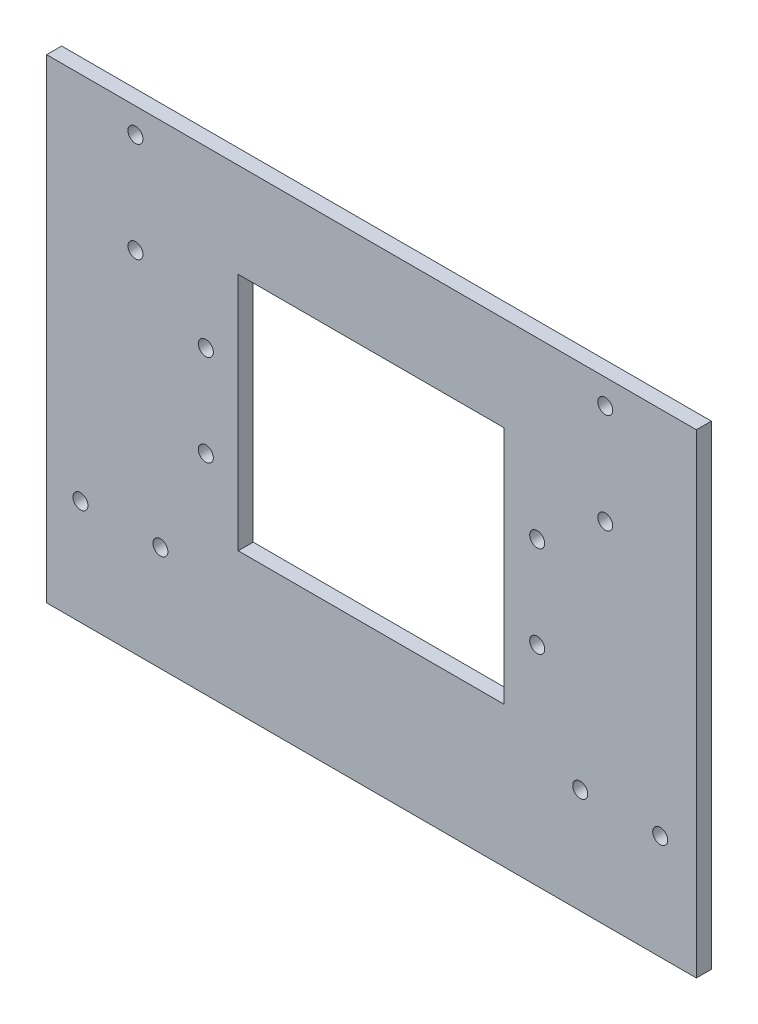
ISO-10303-21;
HEADER;
FILE_DESCRIPTION(('STEP AP214'),'2;1');
FILE_NAME('part.step','',(''),(''),'','','');
FILE_SCHEMA(('AUTOMOTIVE_DESIGN { 1 0 10303 214 1 1 1 1 }'));
ENDSEC;
DATA;
#1=APPLICATION_CONTEXT('core data for automotive mechanical design processes');
#2=APPLICATION_PROTOCOL_DEFINITION('international standard','automotive_design',2000,#1);
#3=PRODUCT_CONTEXT('',#1,'mechanical');
#4=PRODUCT('Part','Part','',(#3));
#5=PRODUCT_RELATED_PRODUCT_CATEGORY('part','',(#4));
#6=PRODUCT_DEFINITION_FORMATION('','',#4);
#7=PRODUCT_DEFINITION_CONTEXT('part definition',#1,'design');
#8=PRODUCT_DEFINITION('design','',#6,#7);
#9=PRODUCT_DEFINITION_SHAPE('','',#8);
#10=(LENGTH_UNIT() NAMED_UNIT(*) SI_UNIT(.MILLI.,.METRE.));
#11=(NAMED_UNIT(*) PLANE_ANGLE_UNIT() SI_UNIT($,.RADIAN.));
#12=(NAMED_UNIT(*) SI_UNIT($,.STERADIAN.) SOLID_ANGLE_UNIT());
#13=UNCERTAINTY_MEASURE_WITH_UNIT(LENGTH_MEASURE(1.E-05),#10,'distance_accuracy_value','');
#14=(GEOMETRIC_REPRESENTATION_CONTEXT(3) GLOBAL_UNCERTAINTY_ASSIGNED_CONTEXT((#13)) GLOBAL_UNIT_ASSIGNED_CONTEXT((#10,
#11,#12)) REPRESENTATION_CONTEXT('',''));
#15=CARTESIAN_POINT('',(0.,0.,0.));
#16=DIRECTION('',(0.,0.,1.));
#17=DIRECTION('',(1.,0.,0.));
#18=AXIS2_PLACEMENT_3D('',#15,#16,#17);
#19=CARTESIAN_POINT('',(-65.,-47.5,3.));
#20=DIRECTION('',(1.,0.,0.));
#21=DIRECTION('',(0.,0.,-1.));
#22=AXIS2_PLACEMENT_3D('',#19,#20,#21);
#23=PLANE('',#22);
#24=DIRECTION('',(0.,-1.,0.));
#25=VECTOR('',#24,1.);
#26=CARTESIAN_POINT('',(-65.,-47.5,0.));
#27=LINE('',#26,#25);
#28=CARTESIAN_POINT('',(-65.,47.5,0.));
#29=VERTEX_POINT('',#28);
#30=CARTESIAN_POINT('',(-65.,-47.5,0.));
#31=VERTEX_POINT('',#30);
#32=EDGE_CURVE('E211',#29,#31,#27,.T.);
#33=ORIENTED_EDGE('',*,*,#32,.T.);
#34=DIRECTION('',(0.,0.,-1.));
#35=VECTOR('',#34,1.);
#36=CARTESIAN_POINT('',(-65.,-47.5,3.));
#37=LINE('',#36,#35);
#38=CARTESIAN_POINT('',(-65.,-47.5,3.));
#39=VERTEX_POINT('',#38);
#40=EDGE_CURVE('E249',#39,#31,#37,.T.);
#41=ORIENTED_EDGE('',*,*,#40,.F.);
#42=DIRECTION('',(0.,-1.,0.));
#43=VECTOR('',#42,1.);
#44=CARTESIAN_POINT('',(-65.,-47.5,3.));
#45=LINE('',#44,#43);
#46=CARTESIAN_POINT('',(-65.,47.5,3.));
#47=VERTEX_POINT('',#46);
#48=EDGE_CURVE('E212',#47,#39,#45,.T.);
#49=ORIENTED_EDGE('',*,*,#48,.F.);
#50=DIRECTION('',(0.,0.,-1.));
#51=VECTOR('',#50,1.);
#52=CARTESIAN_POINT('',(-65.,47.5,3.));
#53=LINE('',#52,#51);
#54=EDGE_CURVE('E226',#47,#29,#53,.T.);
#55=ORIENTED_EDGE('',*,*,#54,.T.);
#56=EDGE_LOOP('',(#33,#41,#49,#55));
#57=FACE_BOUND('',#56,.T.);
#58=ADVANCED_FACE('F44',(#57),#23,.F.);
#59=CARTESIAN_POINT('',(65.,-47.5,3.));
#60=DIRECTION('',(0.,1.,0.));
#61=DIRECTION('',(-1.,0.,0.));
#62=AXIS2_PLACEMENT_3D('',#59,#60,#61);
#63=PLANE('',#62);
#64=DIRECTION('',(1.,0.,0.));
#65=VECTOR('',#64,1.);
#66=CARTESIAN_POINT('',(65.,-47.5,0.));
#67=LINE('',#66,#65);
#68=CARTESIAN_POINT('',(65.,-47.5,0.));
#69=VERTEX_POINT('',#68);
#70=EDGE_CURVE('E230',#31,#69,#67,.T.);
#71=ORIENTED_EDGE('',*,*,#70,.T.);
#72=DIRECTION('',(0.,0.,-1.));
#73=VECTOR('',#72,1.);
#74=CARTESIAN_POINT('',(65.,-47.5,3.));
#75=LINE('',#74,#73);
#76=CARTESIAN_POINT('',(65.,-47.5,3.));
#77=VERTEX_POINT('',#76);
#78=EDGE_CURVE('E245',#77,#69,#75,.T.);
#79=ORIENTED_EDGE('',*,*,#78,.F.);
#80=DIRECTION('',(1.,0.,0.));
#81=VECTOR('',#80,1.);
#82=CARTESIAN_POINT('',(65.,-47.5,3.));
#83=LINE('',#82,#81);
#84=EDGE_CURVE('E216',#39,#77,#83,.T.);
#85=ORIENTED_EDGE('',*,*,#84,.F.);
#86=ORIENTED_EDGE('',*,*,#40,.T.);
#87=EDGE_LOOP('',(#71,#79,#85,#86));
#88=FACE_BOUND('',#87,.T.);
#89=ADVANCED_FACE('F292',(#88),#63,.F.);
#90=CARTESIAN_POINT('',(65.,-47.5,3.));
#91=DIRECTION('',(-1.,0.,0.));
#92=DIRECTION('',(0.,0.,1.));
#93=AXIS2_PLACEMENT_3D('',#90,#91,#92);
#94=PLANE('',#93);
#95=DIRECTION('',(0.,1.,0.));
#96=VECTOR('',#95,1.);
#97=CARTESIAN_POINT('',(65.,-47.5,0.));
#98=LINE('',#97,#96);
#99=CARTESIAN_POINT('',(65.,47.5,0.));
#100=VERTEX_POINT('',#99);
#101=EDGE_CURVE('E233',#69,#100,#98,.T.);
#102=ORIENTED_EDGE('',*,*,#101,.T.);
#103=DIRECTION('',(0.,0.,-1.));
#104=VECTOR('',#103,1.);
#105=CARTESIAN_POINT('',(65.,47.5,3.));
#106=LINE('',#105,#104);
#107=CARTESIAN_POINT('',(65.,47.5,3.));
#108=VERTEX_POINT('',#107);
#109=EDGE_CURVE('E241',#108,#100,#106,.T.);
#110=ORIENTED_EDGE('',*,*,#109,.F.);
#111=DIRECTION('',(0.,1.,0.));
#112=VECTOR('',#111,1.);
#113=CARTESIAN_POINT('',(65.,-47.5,3.));
#114=LINE('',#113,#112);
#115=EDGE_CURVE('E220',#77,#108,#114,.T.);
#116=ORIENTED_EDGE('',*,*,#115,.F.);
#117=ORIENTED_EDGE('',*,*,#78,.T.);
#118=EDGE_LOOP('',(#102,#110,#116,#117));
#119=FACE_BOUND('',#118,.T.);
#120=ADVANCED_FACE('F297',(#119),#94,.F.);
#121=CARTESIAN_POINT('',(65.,47.5,3.));
#122=DIRECTION('',(0.,-1.,0.));
#123=DIRECTION('',(1.,0.,0.));
#124=AXIS2_PLACEMENT_3D('',#121,#122,#123);
#125=PLANE('',#124);
#126=DIRECTION('',(-1.,0.,0.));
#127=VECTOR('',#126,1.);
#128=CARTESIAN_POINT('',(65.,47.5,0.));
#129=LINE('',#128,#127);
#130=EDGE_CURVE('E217',#100,#29,#129,.T.);
#131=ORIENTED_EDGE('',*,*,#130,.T.);
#132=ORIENTED_EDGE('',*,*,#54,.F.);
#133=DIRECTION('',(-1.,0.,0.));
#134=VECTOR('',#133,1.);
#135=CARTESIAN_POINT('',(65.,47.5,3.));
#136=LINE('',#135,#134);
#137=EDGE_CURVE('E223',#108,#47,#136,.T.);
#138=ORIENTED_EDGE('',*,*,#137,.F.);
#139=ORIENTED_EDGE('',*,*,#109,.T.);
#140=EDGE_LOOP('',(#131,#132,#138,#139));
#141=FACE_BOUND('',#140,.T.);
#142=ADVANCED_FACE('F312',(#141),#125,.F.);
#143=CARTESIAN_POINT('',(0.,0.,3.));
#144=DIRECTION('',(0.,0.,1.));
#145=DIRECTION('',(1.,0.,0.));
#146=AXIS2_PLACEMENT_3D('',#143,#144,#145);
#147=PLANE('',#146);
#148=CARTESIAN_POINT('',(33.15,-5.69741209793691,3.));
#149=DIRECTION('',(0.,0.,1.));
#150=DIRECTION('',(1.,0.,0.));
#151=AXIS2_PLACEMENT_3D('',#148,#149,#150);
#152=CIRCLE('',#151,1.5);
#153=CARTESIAN_POINT('',(34.65,-5.69741209793691,3.));
#154=VERTEX_POINT('',#153);
#155=EDGE_CURVE('E403',#154,#154,#152,.T.);
#156=ORIENTED_EDGE('',*,*,#155,.F.);
#157=EDGE_LOOP('',(#156));
#158=FACE_BOUND('',#157,.T.);
#159=CARTESIAN_POINT('',(33.15,12.6025879020631,3.));
#160=DIRECTION('',(0.,0.,1.));
#161=DIRECTION('',(1.,0.,0.));
#162=AXIS2_PLACEMENT_3D('',#159,#160,#161);
#163=CIRCLE('',#162,1.5);
#164=CARTESIAN_POINT('',(34.65,12.6025879020631,3.));
#165=VERTEX_POINT('',#164);
#166=EDGE_CURVE('E406',#165,#165,#163,.T.);
#167=ORIENTED_EDGE('',*,*,#166,.F.);
#168=EDGE_LOOP('',(#167));
#169=FACE_BOUND('',#168,.T.);
#170=CARTESIAN_POINT('',(-33.15,-5.69741209793692,3.));
#171=DIRECTION('',(0.,0.,1.));
#172=DIRECTION('',(1.,0.,0.));
#173=AXIS2_PLACEMENT_3D('',#170,#171,#172);
#174=CIRCLE('',#173,1.5);
#175=CARTESIAN_POINT('',(-31.65,-5.69741209793692,3.));
#176=VERTEX_POINT('',#175);
#177=EDGE_CURVE('E400',#176,#176,#174,.T.);
#178=ORIENTED_EDGE('',*,*,#177,.F.);
#179=EDGE_LOOP('',(#178));
#180=FACE_BOUND('',#179,.T.);
#181=CARTESIAN_POINT('',(-33.15,12.6025879020631,3.));
#182=DIRECTION('',(0.,0.,1.));
#183=DIRECTION('',(1.,0.,0.));
#184=AXIS2_PLACEMENT_3D('',#181,#182,#183);
#185=CIRCLE('',#184,1.5);
#186=CARTESIAN_POINT('',(-31.65,12.6025879020631,3.));
#187=VERTEX_POINT('',#186);
#188=EDGE_CURVE('E397',#187,#187,#185,.T.);
#189=ORIENTED_EDGE('',*,*,#188,.F.);
#190=EDGE_LOOP('',(#189));
#191=FACE_BOUND('',#190,.T.);
#192=DIRECTION('',(0.,-1.,0.));
#193=VECTOR('',#192,1.);
#194=CARTESIAN_POINT('',(-26.6718393666352,-19.3053115784174,3.));
#195=LINE('',#194,#193);
#196=CARTESIAN_POINT('',(-26.6718393666352,28.6025879020631,3.));
#197=VERTEX_POINT('',#196);
#198=CARTESIAN_POINT('',(-26.6718393666352,-19.3053115784174,3.));
#199=VERTEX_POINT('',#198);
#200=EDGE_CURVE('E61',#197,#199,#195,.T.);
#201=ORIENTED_EDGE('',*,*,#200,.F.);
#202=DIRECTION('',(-1.,0.,0.));
#203=VECTOR('',#202,1.);
#204=CARTESIAN_POINT('',(-26.6718393666352,28.6025879020631,3.));
#205=LINE('',#204,#203);
#206=CARTESIAN_POINT('',(26.4781370833923,28.6025879020631,3.));
#207=VERTEX_POINT('',#206);
#208=EDGE_CURVE('E132',#207,#197,#205,.T.);
#209=ORIENTED_EDGE('',*,*,#208,.F.);
#210=DIRECTION('',(0.,1.,0.));
#211=VECTOR('',#210,1.);
#212=CARTESIAN_POINT('',(26.4781370833923,-19.3053115784174,3.));
#213=LINE('',#212,#211);
#214=CARTESIAN_POINT('',(26.4781370833923,-19.3053115784174,3.));
#215=VERTEX_POINT('',#214);
#216=EDGE_CURVE('E114',#215,#207,#213,.T.);
#217=ORIENTED_EDGE('',*,*,#216,.F.);
#218=DIRECTION('',(1.,0.,0.));
#219=VECTOR('',#218,1.);
#220=CARTESIAN_POINT('',(-26.6718393666352,-19.3053115784174,3.));
#221=LINE('',#220,#219);
#222=EDGE_CURVE('E124',#199,#215,#221,.T.);
#223=ORIENTED_EDGE('',*,*,#222,.F.);
#224=EDGE_LOOP('',(#201,#209,#217,#223));
#225=FACE_BOUND('',#224,.T.);
#226=CARTESIAN_POINT('',(46.7671126155352,22.5,3.));
#227=DIRECTION('',(0.,0.,1.));
#228=DIRECTION('',(1.,0.,0.));
#229=AXIS2_PLACEMENT_3D('',#226,#227,#228);
#230=CIRCLE('',#229,1.5);
#231=CARTESIAN_POINT('',(48.2671126155352,22.5,3.));
#232=VERTEX_POINT('',#231);
#233=EDGE_CURVE('E175',#232,#232,#230,.T.);
#234=ORIENTED_EDGE('',*,*,#233,.F.);
#235=EDGE_LOOP('',(#234));
#236=FACE_BOUND('',#235,.T.);
#237=CARTESIAN_POINT('',(-47.2328873844649,42.5,3.));
#238=DIRECTION('',(0.,0.,1.));
#239=DIRECTION('',(1.,0.,0.));
#240=AXIS2_PLACEMENT_3D('',#237,#238,#239);
#241=CIRCLE('',#240,1.5);
#242=CARTESIAN_POINT('',(-45.7328873844649,42.5,3.));
#243=VERTEX_POINT('',#242);
#244=EDGE_CURVE('E171',#243,#243,#241,.T.);
#245=ORIENTED_EDGE('',*,*,#244,.F.);
#246=EDGE_LOOP('',(#245));
#247=FACE_BOUND('',#246,.T.);
#248=CARTESIAN_POINT('',(-47.2328873844649,22.5,3.));
#249=DIRECTION('',(0.,0.,1.));
#250=DIRECTION('',(1.,0.,0.));
#251=AXIS2_PLACEMENT_3D('',#248,#249,#250);
#252=CIRCLE('',#251,1.5);
#253=CARTESIAN_POINT('',(-45.7328873844649,22.5,3.));
#254=VERTEX_POINT('',#253);
#255=EDGE_CURVE('E167',#254,#254,#252,.T.);
#256=ORIENTED_EDGE('',*,*,#255,.F.);
#257=EDGE_LOOP('',(#256));
#258=FACE_BOUND('',#257,.T.);
#259=CARTESIAN_POINT('',(46.7671126155352,42.5,3.));
#260=DIRECTION('',(0.,0.,1.));
#261=DIRECTION('',(1.,0.,0.));
#262=AXIS2_PLACEMENT_3D('',#259,#260,#261);
#263=CIRCLE('',#262,1.5);
#264=CARTESIAN_POINT('',(48.2671126155352,42.5,3.));
#265=VERTEX_POINT('',#264);
#266=EDGE_CURVE('E163',#265,#265,#263,.T.);
#267=ORIENTED_EDGE('',*,*,#266,.F.);
#268=EDGE_LOOP('',(#267));
#269=FACE_BOUND('',#268,.T.);
#270=CARTESIAN_POINT('',(57.7671126155351,-26.5,3.));
#271=DIRECTION('',(0.,0.,1.));
#272=DIRECTION('',(1.,0.,0.));
#273=AXIS2_PLACEMENT_3D('',#270,#271,#272);
#274=CIRCLE('',#273,1.5);
#275=CARTESIAN_POINT('',(59.2671126155351,-26.5,3.));
#276=VERTEX_POINT('',#275);
#277=EDGE_CURVE('E207',#276,#276,#274,.T.);
#278=ORIENTED_EDGE('',*,*,#277,.F.);
#279=EDGE_LOOP('',(#278));
#280=FACE_BOUND('',#279,.T.);
#281=CARTESIAN_POINT('',(41.7671126155351,-26.5,3.));
#282=DIRECTION('',(0.,0.,1.));
#283=DIRECTION('',(1.,0.,0.));
#284=AXIS2_PLACEMENT_3D('',#281,#282,#283);
#285=CIRCLE('',#284,1.5);
#286=CARTESIAN_POINT('',(43.2671126155351,-26.5,3.));
#287=VERTEX_POINT('',#286);
#288=EDGE_CURVE('E203',#287,#287,#285,.T.);
#289=ORIENTED_EDGE('',*,*,#288,.F.);
#290=EDGE_LOOP('',(#289));
#291=FACE_BOUND('',#290,.T.);
#292=CARTESIAN_POINT('',(-42.2328873844649,-26.5,3.));
#293=DIRECTION('',(0.,0.,1.));
#294=DIRECTION('',(1.,0.,0.));
#295=AXIS2_PLACEMENT_3D('',#292,#293,#294);
#296=CIRCLE('',#295,1.5);
#297=CARTESIAN_POINT('',(-40.7328873844649,-26.5,3.));
#298=VERTEX_POINT('',#297);
#299=EDGE_CURVE('E199',#298,#298,#296,.T.);
#300=ORIENTED_EDGE('',*,*,#299,.F.);
#301=EDGE_LOOP('',(#300));
#302=FACE_BOUND('',#301,.T.);
#303=CARTESIAN_POINT('',(-58.2328873844649,-26.5,3.));
#304=DIRECTION('',(0.,0.,1.));
#305=DIRECTION('',(1.,0.,0.));
#306=AXIS2_PLACEMENT_3D('',#303,#304,#305);
#307=CIRCLE('',#306,1.5);
#308=CARTESIAN_POINT('',(-56.7328873844649,-26.5,3.));
#309=VERTEX_POINT('',#308);
#310=EDGE_CURVE('E184',#309,#309,#307,.T.);
#311=ORIENTED_EDGE('',*,*,#310,.F.);
#312=EDGE_LOOP('',(#311));
#313=FACE_BOUND('',#312,.T.);
#314=ORIENTED_EDGE('',*,*,#48,.T.);
#315=ORIENTED_EDGE('',*,*,#84,.T.);
#316=ORIENTED_EDGE('',*,*,#115,.T.);
#317=ORIENTED_EDGE('',*,*,#137,.T.);
#318=EDGE_LOOP('',(#314,#315,#316,#317));
#319=FACE_BOUND('',#318,.T.);
#320=ADVANCED_FACE('F129',(#158,#169,#180,#191,#225,#236,#247,#258,#269,#280,#291,#302,#313,
#319),#147,.T.);
#321=CARTESIAN_POINT('',(0.,0.,0.));
#322=DIRECTION('',(0.,0.,1.));
#323=DIRECTION('',(1.,0.,0.));
#324=AXIS2_PLACEMENT_3D('',#321,#322,#323);
#325=PLANE('',#324);
#326=CARTESIAN_POINT('',(33.15,-5.69741209793691,0.));
#327=DIRECTION('',(0.,0.,1.));
#328=DIRECTION('',(1.,0.,0.));
#329=AXIS2_PLACEMENT_3D('',#326,#327,#328);
#330=CIRCLE('',#329,1.5);
#331=CARTESIAN_POINT('',(34.65,-5.69741209793691,0.));
#332=VERTEX_POINT('',#331);
#333=EDGE_CURVE('E47',#332,#332,#330,.T.);
#334=ORIENTED_EDGE('',*,*,#333,.T.);
#335=EDGE_LOOP('',(#334));
#336=FACE_BOUND('',#335,.T.);
#337=CARTESIAN_POINT('',(33.15,12.6025879020631,0.));
#338=DIRECTION('',(0.,0.,1.));
#339=DIRECTION('',(1.,0.,0.));
#340=AXIS2_PLACEMENT_3D('',#337,#338,#339);
#341=CIRCLE('',#340,1.5);
#342=CARTESIAN_POINT('',(34.65,12.6025879020631,0.));
#343=VERTEX_POINT('',#342);
#344=EDGE_CURVE('E267',#343,#343,#341,.T.);
#345=ORIENTED_EDGE('',*,*,#344,.T.);
#346=EDGE_LOOP('',(#345));
#347=FACE_BOUND('',#346,.T.);
#348=CARTESIAN_POINT('',(-33.15,-5.69741209793692,0.));
#349=DIRECTION('',(0.,0.,1.));
#350=DIRECTION('',(1.,0.,0.));
#351=AXIS2_PLACEMENT_3D('',#348,#349,#350);
#352=CIRCLE('',#351,1.5);
#353=CARTESIAN_POINT('',(-31.65,-5.69741209793692,0.));
#354=VERTEX_POINT('',#353);
#355=EDGE_CURVE('E264',#354,#354,#352,.T.);
#356=ORIENTED_EDGE('',*,*,#355,.T.);
#357=EDGE_LOOP('',(#356));
#358=FACE_BOUND('',#357,.T.);
#359=CARTESIAN_POINT('',(-33.15,12.6025879020631,0.));
#360=DIRECTION('',(0.,0.,1.));
#361=DIRECTION('',(1.,0.,0.));
#362=AXIS2_PLACEMENT_3D('',#359,#360,#361);
#363=CIRCLE('',#362,1.5);
#364=CARTESIAN_POINT('',(-31.65,12.6025879020631,0.));
#365=VERTEX_POINT('',#364);
#366=EDGE_CURVE('E142',#365,#365,#363,.T.);
#367=ORIENTED_EDGE('',*,*,#366,.T.);
#368=EDGE_LOOP('',(#367));
#369=FACE_BOUND('',#368,.T.);
#370=DIRECTION('',(-1.,0.,0.));
#371=VECTOR('',#370,1.);
#372=CARTESIAN_POINT('',(0.,28.6025879020631,0.));
#373=LINE('',#372,#371);
#374=CARTESIAN_POINT('',(26.4781370833923,28.6025879020631,0.));
#375=VERTEX_POINT('',#374);
#376=CARTESIAN_POINT('',(-26.6718393666352,28.6025879020631,0.));
#377=VERTEX_POINT('',#376);
#378=EDGE_CURVE('E53',#375,#377,#373,.T.);
#379=ORIENTED_EDGE('',*,*,#378,.T.);
#380=DIRECTION('',(0.,-1.,0.));
#381=VECTOR('',#380,1.);
#382=CARTESIAN_POINT('',(-26.6718393666352,0.,0.));
#383=LINE('',#382,#381);
#384=CARTESIAN_POINT('',(-26.6718393666352,-19.3053115784174,0.));
#385=VERTEX_POINT('',#384);
#386=EDGE_CURVE('E11',#377,#385,#383,.T.);
#387=ORIENTED_EDGE('',*,*,#386,.T.);
#388=DIRECTION('',(1.,0.,0.));
#389=VECTOR('',#388,1.);
#390=CARTESIAN_POINT('',(0.,-19.3053115784174,0.));
#391=LINE('',#390,#389);
#392=CARTESIAN_POINT('',(26.4781370833923,-19.3053115784174,0.));
#393=VERTEX_POINT('',#392);
#394=EDGE_CURVE('E253',#385,#393,#391,.T.);
#395=ORIENTED_EDGE('',*,*,#394,.T.);
#396=DIRECTION('',(0.,1.,0.));
#397=VECTOR('',#396,1.);
#398=CARTESIAN_POINT('',(26.4781370833923,0.,0.));
#399=LINE('',#398,#397);
#400=EDGE_CURVE('E117',#393,#375,#399,.T.);
#401=ORIENTED_EDGE('',*,*,#400,.T.);
#402=EDGE_LOOP('',(#379,#387,#395,#401));
#403=FACE_BOUND('',#402,.T.);
#404=CARTESIAN_POINT('',(46.7671126155352,22.5,0.));
#405=DIRECTION('',(0.,0.,-1.));
#406=DIRECTION('',(-1.,0.,0.));
#407=AXIS2_PLACEMENT_3D('',#404,#405,#406);
#408=CIRCLE('',#407,1.5);
#409=CARTESIAN_POINT('',(45.2671126155352,22.5,0.));
#410=VERTEX_POINT('',#409);
#411=EDGE_CURVE('E152',#410,#410,#408,.T.);
#412=ORIENTED_EDGE('',*,*,#411,.F.);
#413=EDGE_LOOP('',(#412));
#414=FACE_BOUND('',#413,.T.);
#415=CARTESIAN_POINT('',(-47.2328873844649,42.5,0.));
#416=DIRECTION('',(0.,0.,-1.));
#417=DIRECTION('',(-1.,0.,0.));
#418=AXIS2_PLACEMENT_3D('',#415,#416,#417);
#419=CIRCLE('',#418,1.5);
#420=CARTESIAN_POINT('',(-48.7328873844649,42.5,0.));
#421=VERTEX_POINT('',#420);
#422=EDGE_CURVE('E151',#421,#421,#419,.T.);
#423=ORIENTED_EDGE('',*,*,#422,.F.);
#424=EDGE_LOOP('',(#423));
#425=FACE_BOUND('',#424,.T.);
#426=CARTESIAN_POINT('',(-47.2328873844649,22.5,0.));
#427=DIRECTION('',(0.,0.,-1.));
#428=DIRECTION('',(-1.,0.,0.));
#429=AXIS2_PLACEMENT_3D('',#426,#427,#428);
#430=CIRCLE('',#429,1.5);
#431=CARTESIAN_POINT('',(-48.7328873844649,22.5,0.));
#432=VERTEX_POINT('',#431);
#433=EDGE_CURVE('E147',#432,#432,#430,.T.);
#434=ORIENTED_EDGE('',*,*,#433,.F.);
#435=EDGE_LOOP('',(#434));
#436=FACE_BOUND('',#435,.T.);
#437=CARTESIAN_POINT('',(46.7671126155352,42.5,0.));
#438=DIRECTION('',(0.,0.,-1.));
#439=DIRECTION('',(-1.,0.,0.));
#440=AXIS2_PLACEMENT_3D('',#437,#438,#439);
#441=CIRCLE('',#440,1.5);
#442=CARTESIAN_POINT('',(45.2671126155352,42.5,0.));
#443=VERTEX_POINT('',#442);
#444=EDGE_CURVE('E156',#443,#443,#441,.T.);
#445=ORIENTED_EDGE('',*,*,#444,.F.);
#446=EDGE_LOOP('',(#445));
#447=FACE_BOUND('',#446,.T.);
#448=CARTESIAN_POINT('',(57.7671126155351,-26.5,0.));
#449=DIRECTION('',(0.,0.,-1.));
#450=DIRECTION('',(-1.,0.,0.));
#451=AXIS2_PLACEMENT_3D('',#448,#449,#450);
#452=CIRCLE('',#451,1.5);
#453=CARTESIAN_POINT('',(56.2671126155351,-26.5,0.));
#454=VERTEX_POINT('',#453);
#455=EDGE_CURVE('E180',#454,#454,#452,.T.);
#456=ORIENTED_EDGE('',*,*,#455,.F.);
#457=EDGE_LOOP('',(#456));
#458=FACE_BOUND('',#457,.T.);
#459=CARTESIAN_POINT('',(41.7671126155351,-26.5,0.));
#460=DIRECTION('',(0.,0.,-1.));
#461=DIRECTION('',(-1.,0.,0.));
#462=AXIS2_PLACEMENT_3D('',#459,#460,#461);
#463=CIRCLE('',#462,1.5);
#464=CARTESIAN_POINT('',(40.2671126155351,-26.5,0.));
#465=VERTEX_POINT('',#464);
#466=EDGE_CURVE('E185',#465,#465,#463,.T.);
#467=ORIENTED_EDGE('',*,*,#466,.F.);
#468=EDGE_LOOP('',(#467));
#469=FACE_BOUND('',#468,.T.);
#470=CARTESIAN_POINT('',(-42.2328873844649,-26.5,0.));
#471=DIRECTION('',(0.,0.,-1.));
#472=DIRECTION('',(-1.,0.,0.));
#473=AXIS2_PLACEMENT_3D('',#470,#471,#472);
#474=CIRCLE('',#473,1.5);
#475=CARTESIAN_POINT('',(-43.7328873844649,-26.5,0.));
#476=VERTEX_POINT('',#475);
#477=EDGE_CURVE('E189',#476,#476,#474,.T.);
#478=ORIENTED_EDGE('',*,*,#477,.F.);
#479=EDGE_LOOP('',(#478));
#480=FACE_BOUND('',#479,.T.);
#481=CARTESIAN_POINT('',(-58.2328873844649,-26.5,0.));
#482=DIRECTION('',(0.,0.,-1.));
#483=DIRECTION('',(-1.,0.,0.));
#484=AXIS2_PLACEMENT_3D('',#481,#482,#483);
#485=CIRCLE('',#484,1.5);
#486=CARTESIAN_POINT('',(-59.7328873844649,-26.5,0.));
#487=VERTEX_POINT('',#486);
#488=EDGE_CURVE('E179',#487,#487,#485,.T.);
#489=ORIENTED_EDGE('',*,*,#488,.F.);
#490=EDGE_LOOP('',(#489));
#491=FACE_BOUND('',#490,.T.);
#492=ORIENTED_EDGE('',*,*,#32,.F.);
#493=ORIENTED_EDGE('',*,*,#130,.F.);
#494=ORIENTED_EDGE('',*,*,#101,.F.);
#495=ORIENTED_EDGE('',*,*,#70,.F.);
#496=EDGE_LOOP('',(#492,#493,#494,#495));
#497=FACE_BOUND('',#496,.T.);
#498=ADVANCED_FACE('F276',(#336,#347,#358,#369,#403,#414,#425,#436,#447,#458,#469,#480,#491,
#497),#325,.F.);
#499=CARTESIAN_POINT('',(-58.2328873844649,-26.5,10.));
#500=DIRECTION('',(0.,0.,-1.));
#501=DIRECTION('',(-1.,0.,0.));
#502=AXIS2_PLACEMENT_3D('',#499,#500,#501);
#503=CYLINDRICAL_SURFACE('',#502,1.5);
#504=ORIENTED_EDGE('',*,*,#310,.T.);
#505=EDGE_LOOP('',(#504));
#506=FACE_BOUND('',#505,.T.);
#507=ORIENTED_EDGE('',*,*,#488,.T.);
#508=EDGE_LOOP('',(#507));
#509=FACE_BOUND('',#508,.T.);
#510=ADVANCED_FACE('F323',(#506,#509),#503,.F.);
#511=CARTESIAN_POINT('',(-42.2328873844649,-26.5,10.));
#512=DIRECTION('',(0.,0.,-1.));
#513=DIRECTION('',(-1.,0.,0.));
#514=AXIS2_PLACEMENT_3D('',#511,#512,#513);
#515=CYLINDRICAL_SURFACE('',#514,1.5);
#516=ORIENTED_EDGE('',*,*,#299,.T.);
#517=EDGE_LOOP('',(#516));
#518=FACE_BOUND('',#517,.T.);
#519=ORIENTED_EDGE('',*,*,#477,.T.);
#520=EDGE_LOOP('',(#519));
#521=FACE_BOUND('',#520,.T.);
#522=ADVANCED_FACE('F329',(#518,#521),#515,.F.);
#523=CARTESIAN_POINT('',(41.7671126155351,-26.5,10.));
#524=DIRECTION('',(0.,0.,-1.));
#525=DIRECTION('',(-1.,0.,0.));
#526=AXIS2_PLACEMENT_3D('',#523,#524,#525);
#527=CYLINDRICAL_SURFACE('',#526,1.5);
#528=ORIENTED_EDGE('',*,*,#288,.T.);
#529=EDGE_LOOP('',(#528));
#530=FACE_BOUND('',#529,.T.);
#531=ORIENTED_EDGE('',*,*,#466,.T.);
#532=EDGE_LOOP('',(#531));
#533=FACE_BOUND('',#532,.T.);
#534=ADVANCED_FACE('F333',(#530,#533),#527,.F.);
#535=CARTESIAN_POINT('',(57.7671126155351,-26.5,10.));
#536=DIRECTION('',(0.,0.,-1.));
#537=DIRECTION('',(-1.,0.,0.));
#538=AXIS2_PLACEMENT_3D('',#535,#536,#537);
#539=CYLINDRICAL_SURFACE('',#538,1.5);
#540=ORIENTED_EDGE('',*,*,#277,.T.);
#541=EDGE_LOOP('',(#540));
#542=FACE_BOUND('',#541,.T.);
#543=ORIENTED_EDGE('',*,*,#455,.T.);
#544=EDGE_LOOP('',(#543));
#545=FACE_BOUND('',#544,.T.);
#546=ADVANCED_FACE('F337',(#542,#545),#539,.F.);
#547=CARTESIAN_POINT('',(46.7671126155352,42.5,10.));
#548=DIRECTION('',(0.,0.,-1.));
#549=DIRECTION('',(-1.,0.,0.));
#550=AXIS2_PLACEMENT_3D('',#547,#548,#549);
#551=CYLINDRICAL_SURFACE('',#550,1.5);
#552=ORIENTED_EDGE('',*,*,#266,.T.);
#553=EDGE_LOOP('',(#552));
#554=FACE_BOUND('',#553,.T.);
#555=ORIENTED_EDGE('',*,*,#444,.T.);
#556=EDGE_LOOP('',(#555));
#557=FACE_BOUND('',#556,.T.);
#558=ADVANCED_FACE('F341',(#554,#557),#551,.F.);
#559=CARTESIAN_POINT('',(-47.2328873844649,22.5,10.));
#560=DIRECTION('',(0.,0.,-1.));
#561=DIRECTION('',(-1.,0.,0.));
#562=AXIS2_PLACEMENT_3D('',#559,#560,#561);
#563=CYLINDRICAL_SURFACE('',#562,1.5);
#564=ORIENTED_EDGE('',*,*,#255,.T.);
#565=EDGE_LOOP('',(#564));
#566=FACE_BOUND('',#565,.T.);
#567=ORIENTED_EDGE('',*,*,#433,.T.);
#568=EDGE_LOOP('',(#567));
#569=FACE_BOUND('',#568,.T.);
#570=ADVANCED_FACE('F345',(#566,#569),#563,.F.);
#571=CARTESIAN_POINT('',(-47.2328873844649,42.5,10.));
#572=DIRECTION('',(0.,0.,-1.));
#573=DIRECTION('',(-1.,0.,0.));
#574=AXIS2_PLACEMENT_3D('',#571,#572,#573);
#575=CYLINDRICAL_SURFACE('',#574,1.5);
#576=ORIENTED_EDGE('',*,*,#244,.T.);
#577=EDGE_LOOP('',(#576));
#578=FACE_BOUND('',#577,.T.);
#579=ORIENTED_EDGE('',*,*,#422,.T.);
#580=EDGE_LOOP('',(#579));
#581=FACE_BOUND('',#580,.T.);
#582=ADVANCED_FACE('F347',(#578,#581),#575,.F.);
#583=CARTESIAN_POINT('',(46.7671126155352,22.5,10.));
#584=DIRECTION('',(0.,0.,-1.));
#585=DIRECTION('',(-1.,0.,0.));
#586=AXIS2_PLACEMENT_3D('',#583,#584,#585);
#587=CYLINDRICAL_SURFACE('',#586,1.5);
#588=ORIENTED_EDGE('',*,*,#233,.T.);
#589=EDGE_LOOP('',(#588));
#590=FACE_BOUND('',#589,.T.);
#591=ORIENTED_EDGE('',*,*,#411,.T.);
#592=EDGE_LOOP('',(#591));
#593=FACE_BOUND('',#592,.T.);
#594=ADVANCED_FACE('F350',(#590,#593),#587,.F.);
#595=CARTESIAN_POINT('',(-26.6718393666352,-19.3053115784174,-7.));
#596=DIRECTION('',(-1.,0.,0.));
#597=DIRECTION('',(0.,0.,1.));
#598=AXIS2_PLACEMENT_3D('',#595,#596,#597);
#599=PLANE('',#598);
#600=DIRECTION('',(0.,0.,1.));
#601=VECTOR('',#600,1.);
#602=CARTESIAN_POINT('',(-26.6718393666352,28.6025879020631,-7.));
#603=LINE('',#602,#601);
#604=EDGE_CURVE('E139',#377,#197,#603,.T.);
#605=ORIENTED_EDGE('',*,*,#604,.T.);
#606=ORIENTED_EDGE('',*,*,#200,.T.);
#607=DIRECTION('',(0.,0.,1.));
#608=VECTOR('',#607,1.);
#609=CARTESIAN_POINT('',(-26.6718393666352,-19.3053115784174,-7.));
#610=LINE('',#609,#608);
#611=EDGE_CURVE('E121',#385,#199,#610,.T.);
#612=ORIENTED_EDGE('',*,*,#611,.F.);
#613=ORIENTED_EDGE('',*,*,#386,.F.);
#614=EDGE_LOOP('',(#605,#606,#612,#613));
#615=FACE_BOUND('',#614,.T.);
#616=ADVANCED_FACE('F354',(#615),#599,.F.);
#617=CARTESIAN_POINT('',(-26.6718393666352,28.6025879020631,-7.));
#618=DIRECTION('',(0.,1.,0.));
#619=DIRECTION('',(0.,0.,1.));
#620=AXIS2_PLACEMENT_3D('',#617,#618,#619);
#621=PLANE('',#620);
#622=DIRECTION('',(0.,0.,1.));
#623=VECTOR('',#622,1.);
#624=CARTESIAN_POINT('',(26.4781370833923,28.6025879020631,-7.));
#625=LINE('',#624,#623);
#626=EDGE_CURVE('E120',#375,#207,#625,.T.);
#627=ORIENTED_EDGE('',*,*,#626,.T.);
#628=ORIENTED_EDGE('',*,*,#208,.T.);
#629=ORIENTED_EDGE('',*,*,#604,.F.);
#630=ORIENTED_EDGE('',*,*,#378,.F.);
#631=EDGE_LOOP('',(#627,#628,#629,#630));
#632=FACE_BOUND('',#631,.T.);
#633=ADVANCED_FACE('F361',(#632),#621,.F.);
#634=CARTESIAN_POINT('',(26.4781370833923,-19.3053115784174,-7.));
#635=DIRECTION('',(1.,0.,0.));
#636=DIRECTION('',(0.,0.,-1.));
#637=AXIS2_PLACEMENT_3D('',#634,#635,#636);
#638=PLANE('',#637);
#639=DIRECTION('',(0.,0.,1.));
#640=VECTOR('',#639,1.);
#641=CARTESIAN_POINT('',(26.4781370833923,-19.3053115784174,-7.));
#642=LINE('',#641,#640);
#643=EDGE_CURVE('E69',#393,#215,#642,.T.);
#644=ORIENTED_EDGE('',*,*,#643,.T.);
#645=ORIENTED_EDGE('',*,*,#216,.T.);
#646=ORIENTED_EDGE('',*,*,#626,.F.);
#647=ORIENTED_EDGE('',*,*,#400,.F.);
#648=EDGE_LOOP('',(#644,#645,#646,#647));
#649=FACE_BOUND('',#648,.T.);
#650=ADVANCED_FACE('F111',(#649),#638,.F.);
#651=CARTESIAN_POINT('',(-26.6718393666352,-19.3053115784174,-7.));
#652=DIRECTION('',(0.,-1.,0.));
#653=DIRECTION('',(0.,0.,-1.));
#654=AXIS2_PLACEMENT_3D('',#651,#652,#653);
#655=PLANE('',#654);
#656=ORIENTED_EDGE('',*,*,#611,.T.);
#657=ORIENTED_EDGE('',*,*,#222,.T.);
#658=ORIENTED_EDGE('',*,*,#643,.F.);
#659=ORIENTED_EDGE('',*,*,#394,.F.);
#660=EDGE_LOOP('',(#656,#657,#658,#659));
#661=FACE_BOUND('',#660,.T.);
#662=ADVANCED_FACE('F125',(#661),#655,.F.);
#663=CARTESIAN_POINT('',(-33.15,12.6025879020631,-7.));
#664=DIRECTION('',(0.,0.,1.));
#665=DIRECTION('',(1.,0.,0.));
#666=AXIS2_PLACEMENT_3D('',#663,#664,#665);
#667=CYLINDRICAL_SURFACE('',#666,1.5);
#668=ORIENTED_EDGE('',*,*,#188,.T.);
#669=EDGE_LOOP('',(#668));
#670=FACE_BOUND('',#669,.T.);
#671=ORIENTED_EDGE('',*,*,#366,.F.);
#672=EDGE_LOOP('',(#671));
#673=FACE_BOUND('',#672,.T.);
#674=ADVANCED_FACE('F364',(#670,#673),#667,.F.);
#675=CARTESIAN_POINT('',(-33.15,-5.69741209793692,-7.));
#676=DIRECTION('',(0.,0.,1.));
#677=DIRECTION('',(1.,0.,0.));
#678=AXIS2_PLACEMENT_3D('',#675,#676,#677);
#679=CYLINDRICAL_SURFACE('',#678,1.5);
#680=ORIENTED_EDGE('',*,*,#177,.T.);
#681=EDGE_LOOP('',(#680));
#682=FACE_BOUND('',#681,.T.);
#683=ORIENTED_EDGE('',*,*,#355,.F.);
#684=EDGE_LOOP('',(#683));
#685=FACE_BOUND('',#684,.T.);
#686=ADVANCED_FACE('F286',(#682,#685),#679,.F.);
#687=CARTESIAN_POINT('',(33.15,12.6025879020631,-7.));
#688=DIRECTION('',(0.,0.,1.));
#689=DIRECTION('',(1.,0.,0.));
#690=AXIS2_PLACEMENT_3D('',#687,#688,#689);
#691=CYLINDRICAL_SURFACE('',#690,1.5);
#692=ORIENTED_EDGE('',*,*,#166,.T.);
#693=EDGE_LOOP('',(#692));
#694=FACE_BOUND('',#693,.T.);
#695=ORIENTED_EDGE('',*,*,#344,.F.);
#696=EDGE_LOOP('',(#695));
#697=FACE_BOUND('',#696,.T.);
#698=ADVANCED_FACE('F280',(#694,#697),#691,.F.);
#699=CARTESIAN_POINT('',(33.15,-5.69741209793691,-7.));
#700=DIRECTION('',(0.,0.,1.));
#701=DIRECTION('',(1.,0.,0.));
#702=AXIS2_PLACEMENT_3D('',#699,#700,#701);
#703=CYLINDRICAL_SURFACE('',#702,1.5);
#704=ORIENTED_EDGE('',*,*,#155,.T.);
#705=EDGE_LOOP('',(#704));
#706=FACE_BOUND('',#705,.T.);
#707=ORIENTED_EDGE('',*,*,#333,.F.);
#708=EDGE_LOOP('',(#707));
#709=FACE_BOUND('',#708,.T.);
#710=ADVANCED_FACE('F278',(#706,#709),#703,.F.);
#711=CLOSED_SHELL('',(#58,#89,#120,#142,#320,#498,#510,#522,#534,#546,#558,#570,#582,#594,#616,
#633,#650,#662,#674,#686,#698,#710));
#712=MANIFOLD_SOLID_BREP('B2',#711);
#713=ADVANCED_BREP_SHAPE_REPRESENTATION('',(#18,#712),#14);
#714=SHAPE_DEFINITION_REPRESENTATION(#9,#713);
ENDSEC;
END-ISO-10303-21;
